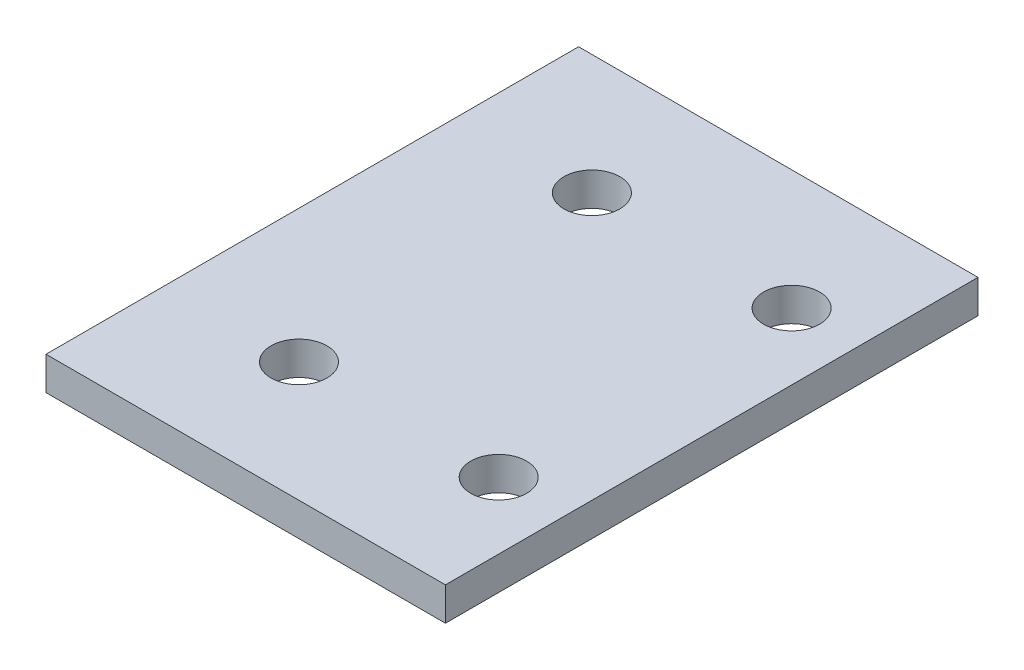
ISO-10303-21;
HEADER;
FILE_DESCRIPTION(('STEP AP214'),'2;1');
FILE_NAME('part.step','',(''),(''),'','','');
FILE_SCHEMA(('AUTOMOTIVE_DESIGN { 1 0 10303 214 1 1 1 1 }'));
ENDSEC;
DATA;
#1=APPLICATION_CONTEXT('core data for automotive mechanical design processes');
#2=APPLICATION_PROTOCOL_DEFINITION('international standard','automotive_design',2000,#1);
#3=PRODUCT_CONTEXT('',#1,'mechanical');
#4=PRODUCT('Part','Part','',(#3));
#5=PRODUCT_RELATED_PRODUCT_CATEGORY('part','',(#4));
#6=PRODUCT_DEFINITION_FORMATION('','',#4);
#7=PRODUCT_DEFINITION_CONTEXT('part definition',#1,'design');
#8=PRODUCT_DEFINITION('design','',#6,#7);
#9=PRODUCT_DEFINITION_SHAPE('','',#8);
#10=(LENGTH_UNIT() NAMED_UNIT(*) SI_UNIT(.MILLI.,.METRE.));
#11=(NAMED_UNIT(*) PLANE_ANGLE_UNIT() SI_UNIT($,.RADIAN.));
#12=(NAMED_UNIT(*) SI_UNIT($,.STERADIAN.) SOLID_ANGLE_UNIT());
#13=UNCERTAINTY_MEASURE_WITH_UNIT(LENGTH_MEASURE(1.E-05),#10,'distance_accuracy_value','');
#14=(GEOMETRIC_REPRESENTATION_CONTEXT(3) GLOBAL_UNCERTAINTY_ASSIGNED_CONTEXT((#13)) GLOBAL_UNIT_ASSIGNED_CONTEXT((#10,
#11,#12)) REPRESENTATION_CONTEXT('',''));
#15=CARTESIAN_POINT('',(0.,0.,0.));
#16=DIRECTION('',(0.,0.,1.));
#17=DIRECTION('',(1.,0.,0.));
#18=AXIS2_PLACEMENT_3D('',#15,#16,#17);
#19=CARTESIAN_POINT('',(0.,2.5,0.));
#20=DIRECTION('',(0.,-1.,0.));
#21=DIRECTION('',(0.,0.,-1.));
#22=AXIS2_PLACEMENT_3D('',#19,#20,#21);
#23=PLANE('',#22);
#24=DIRECTION('',(0.,0.,-1.));
#25=VECTOR('',#24,1.);
#26=CARTESIAN_POINT('',(15.,2.5,20.));
#27=LINE('',#26,#25);
#28=CARTESIAN_POINT('',(15.,2.5,20.));
#29=VERTEX_POINT('',#28);
#30=CARTESIAN_POINT('',(15.,2.5,-20.));
#31=VERTEX_POINT('',#30);
#32=EDGE_CURVE('E98',#29,#31,#27,.T.);
#33=ORIENTED_EDGE('',*,*,#32,.T.);
#34=DIRECTION('',(-1.,0.,0.));
#35=VECTOR('',#34,1.);
#36=CARTESIAN_POINT('',(-15.,2.5,-20.));
#37=LINE('',#36,#35);
#38=CARTESIAN_POINT('',(-15.,2.5,-20.));
#39=VERTEX_POINT('',#38);
#40=EDGE_CURVE('E93',#31,#39,#37,.T.);
#41=ORIENTED_EDGE('',*,*,#40,.T.);
#42=DIRECTION('',(0.,0.,1.));
#43=VECTOR('',#42,1.);
#44=CARTESIAN_POINT('',(-15.,2.5,20.));
#45=LINE('',#44,#43);
#46=CARTESIAN_POINT('',(-15.,2.5,20.));
#47=VERTEX_POINT('',#46);
#48=EDGE_CURVE('E96',#39,#47,#45,.T.);
#49=ORIENTED_EDGE('',*,*,#48,.T.);
#50=DIRECTION('',(1.,0.,0.));
#51=VECTOR('',#50,1.);
#52=CARTESIAN_POINT('',(-15.,2.5,20.));
#53=LINE('',#52,#51);
#54=EDGE_CURVE('E63',#47,#29,#53,.T.);
#55=ORIENTED_EDGE('',*,*,#54,.T.);
#56=EDGE_LOOP('',(#33,#41,#49,#55));
#57=FACE_BOUND('',#56,.T.);
#58=CARTESIAN_POINT('',(10.,2.5,-11.));
#59=DIRECTION('',(0.,1.,0.));
#60=DIRECTION('',(0.,0.,1.));
#61=AXIS2_PLACEMENT_3D('',#58,#59,#60);
#62=CIRCLE('',#61,2.1);
#63=CARTESIAN_POINT('',(10.,2.5,-8.9));
#64=VERTEX_POINT('',#63);
#65=EDGE_CURVE('E118',#64,#64,#62,.T.);
#66=ORIENTED_EDGE('',*,*,#65,.F.);
#67=EDGE_LOOP('',(#66));
#68=FACE_BOUND('',#67,.T.);
#69=CARTESIAN_POINT('',(-5.,2.5,-11.));
#70=DIRECTION('',(0.,1.,0.));
#71=DIRECTION('',(0.,0.,-1.));
#72=AXIS2_PLACEMENT_3D('',#69,#70,#71);
#73=CIRCLE('',#72,2.1);
#74=CARTESIAN_POINT('',(-5.,2.5,-13.1));
#75=VERTEX_POINT('',#74);
#76=EDGE_CURVE('E140',#75,#75,#73,.T.);
#77=ORIENTED_EDGE('',*,*,#76,.F.);
#78=EDGE_LOOP('',(#77));
#79=FACE_BOUND('',#78,.T.);
#80=CARTESIAN_POINT('',(10.,2.5,11.));
#81=DIRECTION('',(0.,1.,0.));
#82=DIRECTION('',(0.,0.,-1.));
#83=AXIS2_PLACEMENT_3D('',#80,#81,#82);
#84=CIRCLE('',#83,2.1);
#85=CARTESIAN_POINT('',(10.,2.5,8.9));
#86=VERTEX_POINT('',#85);
#87=EDGE_CURVE('E148',#86,#86,#84,.T.);
#88=ORIENTED_EDGE('',*,*,#87,.F.);
#89=EDGE_LOOP('',(#88));
#90=FACE_BOUND('',#89,.T.);
#91=CARTESIAN_POINT('',(-5.,2.5,11.));
#92=DIRECTION('',(0.,1.,0.));
#93=DIRECTION('',(0.,0.,1.));
#94=AXIS2_PLACEMENT_3D('',#91,#92,#93);
#95=CIRCLE('',#94,2.1);
#96=CARTESIAN_POINT('',(-5.,2.5,13.1));
#97=VERTEX_POINT('',#96);
#98=EDGE_CURVE('E156',#97,#97,#95,.T.);
#99=ORIENTED_EDGE('',*,*,#98,.F.);
#100=EDGE_LOOP('',(#99));
#101=FACE_BOUND('',#100,.T.);
#102=ADVANCED_FACE('F45',(#57,#68,#79,#90,#101),#23,.F.);
#103=CARTESIAN_POINT('',(0.,0.,0.));
#104=DIRECTION('',(0.,-1.,0.));
#105=DIRECTION('',(0.,0.,-1.));
#106=AXIS2_PLACEMENT_3D('',#103,#104,#105);
#107=PLANE('',#106);
#108=CARTESIAN_POINT('',(10.,0.,11.));
#109=DIRECTION('',(0.,1.,0.));
#110=DIRECTION('',(0.,0.,-1.));
#111=AXIS2_PLACEMENT_3D('',#108,#109,#110);
#112=CIRCLE('',#111,2.1);
#113=CARTESIAN_POINT('',(10.,0.,8.9));
#114=VERTEX_POINT('',#113);
#115=EDGE_CURVE('E152',#114,#114,#112,.T.);
#116=ORIENTED_EDGE('',*,*,#115,.T.);
#117=EDGE_LOOP('',(#116));
#118=FACE_BOUND('',#117,.T.);
#119=CARTESIAN_POINT('',(10.,0.,-11.));
#120=DIRECTION('',(0.,1.,0.));
#121=DIRECTION('',(0.,0.,1.));
#122=AXIS2_PLACEMENT_3D('',#119,#120,#121);
#123=CIRCLE('',#122,2.1);
#124=CARTESIAN_POINT('',(10.,0.,-8.9));
#125=VERTEX_POINT('',#124);
#126=EDGE_CURVE('E136',#125,#125,#123,.T.);
#127=ORIENTED_EDGE('',*,*,#126,.T.);
#128=EDGE_LOOP('',(#127));
#129=FACE_BOUND('',#128,.T.);
#130=DIRECTION('',(0.,0.,-1.));
#131=VECTOR('',#130,1.);
#132=CARTESIAN_POINT('',(15.,0.,20.));
#133=LINE('',#132,#131);
#134=CARTESIAN_POINT('',(15.,0.,20.));
#135=VERTEX_POINT('',#134);
#136=CARTESIAN_POINT('',(15.,0.,-20.));
#137=VERTEX_POINT('',#136);
#138=EDGE_CURVE('E114',#135,#137,#133,.T.);
#139=ORIENTED_EDGE('',*,*,#138,.F.);
#140=DIRECTION('',(1.,0.,0.));
#141=VECTOR('',#140,1.);
#142=CARTESIAN_POINT('',(-15.,0.,20.));
#143=LINE('',#142,#141);
#144=CARTESIAN_POINT('',(-15.,0.,20.));
#145=VERTEX_POINT('',#144);
#146=EDGE_CURVE('E86',#145,#135,#143,.T.);
#147=ORIENTED_EDGE('',*,*,#146,.F.);
#148=DIRECTION('',(0.,0.,1.));
#149=VECTOR('',#148,1.);
#150=CARTESIAN_POINT('',(-15.,0.,20.));
#151=LINE('',#150,#149);
#152=CARTESIAN_POINT('',(-15.,0.,-20.));
#153=VERTEX_POINT('',#152);
#154=EDGE_CURVE('E80',#153,#145,#151,.T.);
#155=ORIENTED_EDGE('',*,*,#154,.F.);
#156=DIRECTION('',(-1.,0.,0.));
#157=VECTOR('',#156,1.);
#158=CARTESIAN_POINT('',(-15.,0.,-20.));
#159=LINE('',#158,#157);
#160=EDGE_CURVE('E103',#137,#153,#159,.T.);
#161=ORIENTED_EDGE('',*,*,#160,.F.);
#162=EDGE_LOOP('',(#139,#147,#155,#161));
#163=FACE_BOUND('',#162,.T.);
#164=CARTESIAN_POINT('',(-5.,0.,-11.));
#165=DIRECTION('',(0.,1.,0.));
#166=DIRECTION('',(0.,0.,-1.));
#167=AXIS2_PLACEMENT_3D('',#164,#165,#166);
#168=CIRCLE('',#167,2.1);
#169=CARTESIAN_POINT('',(-5.,0.,-13.1));
#170=VERTEX_POINT('',#169);
#171=EDGE_CURVE('E144',#170,#170,#168,.T.);
#172=ORIENTED_EDGE('',*,*,#171,.T.);
#173=EDGE_LOOP('',(#172));
#174=FACE_BOUND('',#173,.T.);
#175=CARTESIAN_POINT('',(-5.,0.,11.));
#176=DIRECTION('',(0.,1.,0.));
#177=DIRECTION('',(0.,0.,1.));
#178=AXIS2_PLACEMENT_3D('',#175,#176,#177);
#179=CIRCLE('',#178,2.1);
#180=CARTESIAN_POINT('',(-5.,0.,13.1));
#181=VERTEX_POINT('',#180);
#182=EDGE_CURVE('E160',#181,#181,#179,.T.);
#183=ORIENTED_EDGE('',*,*,#182,.T.);
#184=EDGE_LOOP('',(#183));
#185=FACE_BOUND('',#184,.T.);
#186=ADVANCED_FACE('F131',(#118,#129,#163,#174,#185),#107,.T.);
#187=CARTESIAN_POINT('',(15.,2.5,20.));
#188=DIRECTION('',(-1.,0.,0.));
#189=DIRECTION('',(0.,0.,1.));
#190=AXIS2_PLACEMENT_3D('',#187,#188,#189);
#191=PLANE('',#190);
#192=ORIENTED_EDGE('',*,*,#138,.T.);
#193=DIRECTION('',(0.,-1.,0.));
#194=VECTOR('',#193,1.);
#195=CARTESIAN_POINT('',(15.,2.5,-20.));
#196=LINE('',#195,#194);
#197=EDGE_CURVE('E11',#31,#137,#196,.T.);
#198=ORIENTED_EDGE('',*,*,#197,.F.);
#199=ORIENTED_EDGE('',*,*,#32,.F.);
#200=DIRECTION('',(0.,-1.,0.));
#201=VECTOR('',#200,1.);
#202=CARTESIAN_POINT('',(15.,2.5,20.));
#203=LINE('',#202,#201);
#204=EDGE_CURVE('E110',#29,#135,#203,.T.);
#205=ORIENTED_EDGE('',*,*,#204,.T.);
#206=EDGE_LOOP('',(#192,#198,#199,#205));
#207=FACE_BOUND('',#206,.T.);
#208=ADVANCED_FACE('F47',(#207),#191,.F.);
#209=CARTESIAN_POINT('',(-15.,2.5,-20.));
#210=DIRECTION('',(0.,0.,1.));
#211=DIRECTION('',(1.,0.,0.));
#212=AXIS2_PLACEMENT_3D('',#209,#210,#211);
#213=PLANE('',#212);
#214=ORIENTED_EDGE('',*,*,#160,.T.);
#215=DIRECTION('',(0.,-1.,0.));
#216=VECTOR('',#215,1.);
#217=CARTESIAN_POINT('',(-15.,2.5,-20.));
#218=LINE('',#217,#216);
#219=EDGE_CURVE('E55',#39,#153,#218,.T.);
#220=ORIENTED_EDGE('',*,*,#219,.F.);
#221=ORIENTED_EDGE('',*,*,#40,.F.);
#222=ORIENTED_EDGE('',*,*,#197,.T.);
#223=EDGE_LOOP('',(#214,#220,#221,#222));
#224=FACE_BOUND('',#223,.T.);
#225=ADVANCED_FACE('F102',(#224),#213,.F.);
#226=CARTESIAN_POINT('',(-15.,2.5,20.));
#227=DIRECTION('',(1.,0.,0.));
#228=DIRECTION('',(0.,0.,-1.));
#229=AXIS2_PLACEMENT_3D('',#226,#227,#228);
#230=PLANE('',#229);
#231=ORIENTED_EDGE('',*,*,#154,.T.);
#232=DIRECTION('',(0.,-1.,0.));
#233=VECTOR('',#232,1.);
#234=CARTESIAN_POINT('',(-15.,2.5,20.));
#235=LINE('',#234,#233);
#236=EDGE_CURVE('E105',#47,#145,#235,.T.);
#237=ORIENTED_EDGE('',*,*,#236,.F.);
#238=ORIENTED_EDGE('',*,*,#48,.F.);
#239=ORIENTED_EDGE('',*,*,#219,.T.);
#240=EDGE_LOOP('',(#231,#237,#238,#239));
#241=FACE_BOUND('',#240,.T.);
#242=ADVANCED_FACE('F106',(#241),#230,.F.);
#243=CARTESIAN_POINT('',(-15.,2.5,20.));
#244=DIRECTION('',(0.,0.,-1.));
#245=DIRECTION('',(-1.,0.,0.));
#246=AXIS2_PLACEMENT_3D('',#243,#244,#245);
#247=PLANE('',#246);
#248=ORIENTED_EDGE('',*,*,#146,.T.);
#249=ORIENTED_EDGE('',*,*,#204,.F.);
#250=ORIENTED_EDGE('',*,*,#54,.F.);
#251=ORIENTED_EDGE('',*,*,#236,.T.);
#252=EDGE_LOOP('',(#248,#249,#250,#251));
#253=FACE_BOUND('',#252,.T.);
#254=ADVANCED_FACE('F128',(#253),#247,.F.);
#255=CARTESIAN_POINT('',(10.,2.5,-11.));
#256=DIRECTION('',(0.,-1.,0.));
#257=DIRECTION('',(0.,0.,-1.));
#258=AXIS2_PLACEMENT_3D('',#255,#256,#257);
#259=CYLINDRICAL_SURFACE('',#258,2.1);
#260=ORIENTED_EDGE('',*,*,#65,.T.);
#261=EDGE_LOOP('',(#260));
#262=FACE_BOUND('',#261,.T.);
#263=ORIENTED_EDGE('',*,*,#126,.F.);
#264=EDGE_LOOP('',(#263));
#265=FACE_BOUND('',#264,.T.);
#266=ADVANCED_FACE('F179',(#262,#265),#259,.F.);
#267=CARTESIAN_POINT('',(-5.,2.5,-11.));
#268=DIRECTION('',(0.,-1.,0.));
#269=DIRECTION('',(0.,0.,-1.));
#270=AXIS2_PLACEMENT_3D('',#267,#268,#269);
#271=CYLINDRICAL_SURFACE('',#270,2.1);
#272=ORIENTED_EDGE('',*,*,#76,.T.);
#273=EDGE_LOOP('',(#272));
#274=FACE_BOUND('',#273,.T.);
#275=ORIENTED_EDGE('',*,*,#171,.F.);
#276=EDGE_LOOP('',(#275));
#277=FACE_BOUND('',#276,.T.);
#278=ADVANCED_FACE('F224',(#274,#277),#271,.F.);
#279=CARTESIAN_POINT('',(10.,2.5,11.));
#280=DIRECTION('',(0.,-1.,0.));
#281=DIRECTION('',(0.,0.,-1.));
#282=AXIS2_PLACEMENT_3D('',#279,#280,#281);
#283=CYLINDRICAL_SURFACE('',#282,2.1);
#284=ORIENTED_EDGE('',*,*,#87,.T.);
#285=EDGE_LOOP('',(#284));
#286=FACE_BOUND('',#285,.T.);
#287=ORIENTED_EDGE('',*,*,#115,.F.);
#288=EDGE_LOOP('',(#287));
#289=FACE_BOUND('',#288,.T.);
#290=ADVANCED_FACE('F232',(#286,#289),#283,.F.);
#291=CARTESIAN_POINT('',(-5.,2.5,11.));
#292=DIRECTION('',(0.,-1.,0.));
#293=DIRECTION('',(0.,0.,-1.));
#294=AXIS2_PLACEMENT_3D('',#291,#292,#293);
#295=CYLINDRICAL_SURFACE('',#294,2.1);
#296=ORIENTED_EDGE('',*,*,#98,.T.);
#297=EDGE_LOOP('',(#296));
#298=FACE_BOUND('',#297,.T.);
#299=ORIENTED_EDGE('',*,*,#182,.F.);
#300=EDGE_LOOP('',(#299));
#301=FACE_BOUND('',#300,.T.);
#302=ADVANCED_FACE('F168',(#298,#301),#295,.F.);
#303=CLOSED_SHELL('',(#102,#186,#208,#225,#242,#254,#266,#278,#290,#302));
#304=MANIFOLD_SOLID_BREP('B2',#303);
#305=ADVANCED_BREP_SHAPE_REPRESENTATION('',(#18,#304),#14);
#306=SHAPE_DEFINITION_REPRESENTATION(#9,#305);
ENDSEC;
END-ISO-10303-21;
